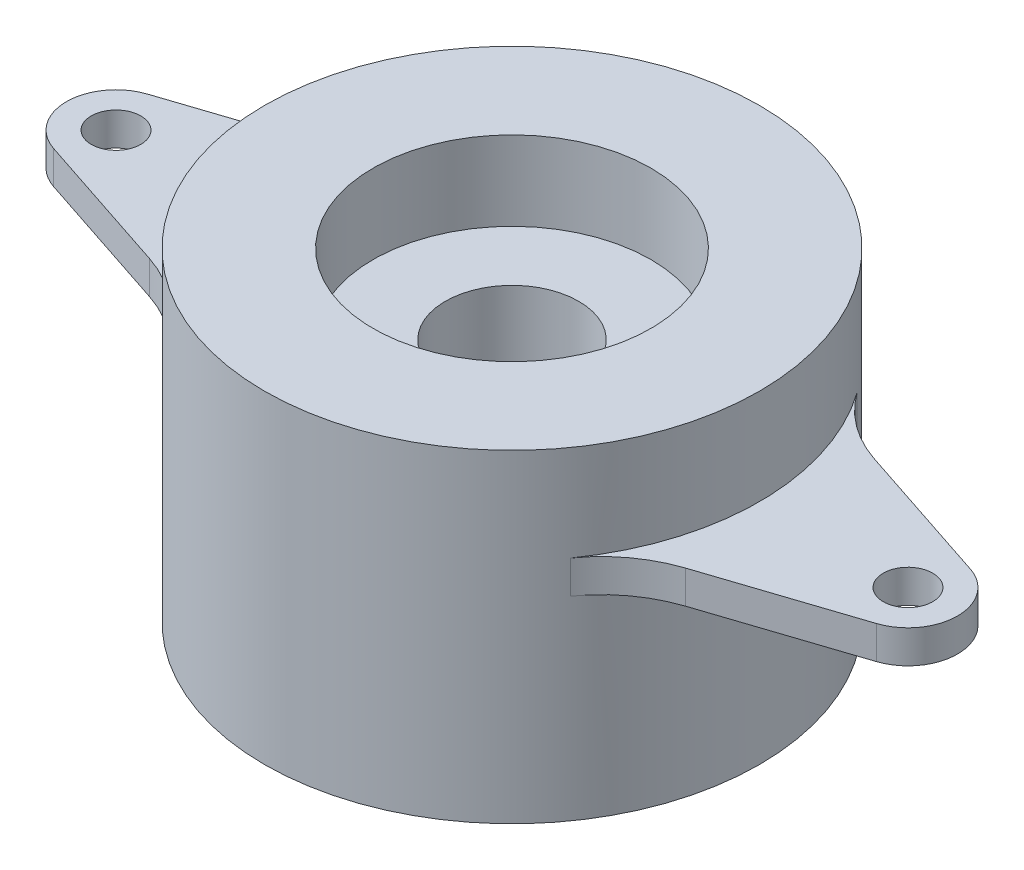
ISO-10303-21;
HEADER;
FILE_DESCRIPTION(('STEP AP214'),'2;1');
FILE_NAME('part.step','',(''),(''),'','','');
FILE_SCHEMA(('AUTOMOTIVE_DESIGN { 1 0 10303 214 1 1 1 1 }'));
ENDSEC;
DATA;
#1=APPLICATION_CONTEXT('core data for automotive mechanical design processes');
#2=APPLICATION_PROTOCOL_DEFINITION('international standard','automotive_design',2000,#1);
#3=PRODUCT_CONTEXT('',#1,'mechanical');
#4=PRODUCT('Part','Part','',(#3));
#5=PRODUCT_RELATED_PRODUCT_CATEGORY('part','',(#4));
#6=PRODUCT_DEFINITION_FORMATION('','',#4);
#7=PRODUCT_DEFINITION_CONTEXT('part definition',#1,'design');
#8=PRODUCT_DEFINITION('design','',#6,#7);
#9=PRODUCT_DEFINITION_SHAPE('','',#8);
#10=(LENGTH_UNIT() NAMED_UNIT(*) SI_UNIT(.MILLI.,.METRE.));
#11=(NAMED_UNIT(*) PLANE_ANGLE_UNIT() SI_UNIT($,.RADIAN.));
#12=(NAMED_UNIT(*) SI_UNIT($,.STERADIAN.) SOLID_ANGLE_UNIT());
#13=UNCERTAINTY_MEASURE_WITH_UNIT(LENGTH_MEASURE(1.E-05),#10,'distance_accuracy_value','');
#14=(GEOMETRIC_REPRESENTATION_CONTEXT(3) GLOBAL_UNCERTAINTY_ASSIGNED_CONTEXT((#13)) GLOBAL_UNIT_ASSIGNED_CONTEXT((#10,
#11,#12)) REPRESENTATION_CONTEXT('',''));
#15=CARTESIAN_POINT('',(0.,0.,0.));
#16=DIRECTION('',(0.,0.,1.));
#17=DIRECTION('',(1.,0.,0.));
#18=AXIS2_PLACEMENT_3D('',#15,#16,#17);
#19=CARTESIAN_POINT('',(0.,0.,0.));
#20=DIRECTION('',(0.,-1.,0.));
#21=DIRECTION('',(0.,0.,-1.));
#22=AXIS2_PLACEMENT_3D('',#19,#20,#21);
#23=CYLINDRICAL_SURFACE('',#22,37.5);
#24=CARTESIAN_POINT('',(0.,24.5,0.));
#25=DIRECTION('',(0.,-1.,0.));
#26=DIRECTION('',(0.,0.,-1.));
#27=AXIS2_PLACEMENT_3D('',#24,#25,#26);
#28=CIRCLE('',#27,37.5);
#29=CARTESIAN_POINT('',(0.,24.5,-37.5));
#30=VERTEX_POINT('',#29);
#31=EDGE_CURVE('E234',#30,#30,#28,.T.);
#32=ORIENTED_EDGE('',*,*,#31,.T.);
#33=EDGE_LOOP('',(#32));
#34=FACE_BOUND('',#33,.T.);
#35=CARTESIAN_POINT('',(0.,-24.5,0.));
#36=DIRECTION('',(0.,-1.,0.));
#37=DIRECTION('',(0.,0.,-1.));
#38=AXIS2_PLACEMENT_3D('',#35,#36,#37);
#39=CIRCLE('',#38,37.5);
#40=CARTESIAN_POINT('',(0.,-24.5,-37.5));
#41=VERTEX_POINT('',#40);
#42=EDGE_CURVE('E231',#41,#41,#39,.T.);
#43=ORIENTED_EDGE('',*,*,#42,.F.);
#44=EDGE_LOOP('',(#43));
#45=FACE_BOUND('',#44,.T.);
#46=CARTESIAN_POINT('',(0.,10.,0.));
#47=DIRECTION('',(0.,1.,0.));
#48=DIRECTION('',(0.,0.,1.));
#49=AXIS2_PLACEMENT_3D('',#46,#47,#48);
#50=CIRCLE('',#49,37.5);
#51=CARTESIAN_POINT('',(-30.5697046910116,10.,21.7196490557362));
#52=VERTEX_POINT('',#51);
#53=CARTESIAN_POINT('',(-30.5697046910116,10.,-21.7196490557362));
#54=VERTEX_POINT('',#53);
#55=EDGE_CURVE('E242',#52,#54,#50,.F.);
#56=ORIENTED_EDGE('',*,*,#55,.F.);
#57=DIRECTION('',(0.,-1.,0.));
#58=VECTOR('',#57,1.);
#59=CARTESIAN_POINT('',(-30.5697046910116,10.,21.7196490557362));
#60=LINE('',#59,#58);
#61=CARTESIAN_POINT('',(-30.5697046910116,5.,21.7196490557362));
#62=VERTEX_POINT('',#61);
#63=EDGE_CURVE('E208',#52,#62,#60,.T.);
#64=ORIENTED_EDGE('',*,*,#63,.T.);
#65=CARTESIAN_POINT('',(0.,5.,0.));
#66=DIRECTION('',(0.,1.,0.));
#67=DIRECTION('',(0.,0.,1.));
#68=AXIS2_PLACEMENT_3D('',#65,#66,#67);
#69=CIRCLE('',#68,37.5);
#70=CARTESIAN_POINT('',(-30.5697046910116,5.,-21.7196490557362));
#71=VERTEX_POINT('',#70);
#72=EDGE_CURVE('E240',#62,#71,#69,.F.);
#73=ORIENTED_EDGE('',*,*,#72,.T.);
#74=DIRECTION('',(0.,-1.,0.));
#75=VECTOR('',#74,1.);
#76=CARTESIAN_POINT('',(-30.5697046910116,10.,-21.7196490557362));
#77=LINE('',#76,#75);
#78=EDGE_CURVE('E205',#54,#71,#77,.T.);
#79=ORIENTED_EDGE('',*,*,#78,.F.);
#80=EDGE_LOOP('',(#56,#64,#73,#79));
#81=FACE_BOUND('',#80,.T.);
#82=CARTESIAN_POINT('',(0.,10.,0.));
#83=DIRECTION('',(0.,-1.,0.));
#84=DIRECTION('',(0.,0.,-1.));
#85=AXIS2_PLACEMENT_3D('',#82,#83,#84);
#86=CIRCLE('',#85,37.5);
#87=CARTESIAN_POINT('',(30.5697046910116,10.,21.7196490557362));
#88=VERTEX_POINT('',#87);
#89=CARTESIAN_POINT('',(30.5697046910116,10.,-21.7196490557362));
#90=VERTEX_POINT('',#89);
#91=EDGE_CURVE('E11',#88,#90,#86,.F.);
#92=ORIENTED_EDGE('',*,*,#91,.T.);
#93=DIRECTION('',(0.,-1.,0.));
#94=VECTOR('',#93,1.);
#95=CARTESIAN_POINT('',(30.5697046910116,10.,-21.7196490557362));
#96=LINE('',#95,#94);
#97=CARTESIAN_POINT('',(30.5697046910116,5.,-21.7196490557362));
#98=VERTEX_POINT('',#97);
#99=EDGE_CURVE('E51',#90,#98,#96,.T.);
#100=ORIENTED_EDGE('',*,*,#99,.T.);
#101=CARTESIAN_POINT('',(0.,5.,0.));
#102=DIRECTION('',(0.,-1.,0.));
#103=DIRECTION('',(0.,0.,-1.));
#104=AXIS2_PLACEMENT_3D('',#101,#102,#103);
#105=CIRCLE('',#104,37.5);
#106=CARTESIAN_POINT('',(30.5697046910116,5.,21.7196490557362));
#107=VERTEX_POINT('',#106);
#108=EDGE_CURVE('E41',#107,#98,#105,.F.);
#109=ORIENTED_EDGE('',*,*,#108,.F.);
#110=DIRECTION('',(0.,-1.,0.));
#111=VECTOR('',#110,1.);
#112=CARTESIAN_POINT('',(30.5697046910116,10.,21.7196490557362));
#113=LINE('',#112,#111);
#114=EDGE_CURVE('E136',#88,#107,#113,.T.);
#115=ORIENTED_EDGE('',*,*,#114,.F.);
#116=EDGE_LOOP('',(#92,#100,#109,#115));
#117=FACE_BOUND('',#116,.T.);
#118=ADVANCED_FACE('F33',(#34,#45,#81,#117),#23,.T.);
#119=CARTESIAN_POINT('',(0.,0.,0.));
#120=DIRECTION('',(0.,-1.,0.));
#121=DIRECTION('',(0.,0.,-1.));
#122=AXIS2_PLACEMENT_3D('',#119,#120,#121);
#123=CYLINDRICAL_SURFACE('',#122,21.05);
#124=CARTESIAN_POINT('',(0.,12.5,0.));
#125=DIRECTION('',(0.,-1.,0.));
#126=DIRECTION('',(0.,0.,-1.));
#127=AXIS2_PLACEMENT_3D('',#124,#125,#126);
#128=CIRCLE('',#127,21.05);
#129=CARTESIAN_POINT('',(0.,12.5,-21.05));
#130=VERTEX_POINT('',#129);
#131=EDGE_CURVE('E216',#130,#130,#128,.T.);
#132=ORIENTED_EDGE('',*,*,#131,.T.);
#133=EDGE_LOOP('',(#132));
#134=FACE_BOUND('',#133,.T.);
#135=CARTESIAN_POINT('',(0.,24.5,0.));
#136=DIRECTION('',(0.,-1.,0.));
#137=DIRECTION('',(0.,0.,-1.));
#138=AXIS2_PLACEMENT_3D('',#135,#136,#137);
#139=CIRCLE('',#138,21.05);
#140=CARTESIAN_POINT('',(0.,24.5,-21.05));
#141=VERTEX_POINT('',#140);
#142=EDGE_CURVE('E237',#141,#141,#139,.T.);
#143=ORIENTED_EDGE('',*,*,#142,.F.);
#144=EDGE_LOOP('',(#143));
#145=FACE_BOUND('',#144,.T.);
#146=ADVANCED_FACE('F35',(#134,#145),#123,.F.);
#147=CARTESIAN_POINT('',(21.05,24.5,0.));
#148=DIRECTION('',(0.,1.,0.));
#149=DIRECTION('',(0.,0.,1.));
#150=AXIS2_PLACEMENT_3D('',#147,#148,#149);
#151=PLANE('',#150);
#152=ORIENTED_EDGE('',*,*,#142,.T.);
#153=EDGE_LOOP('',(#152));
#154=FACE_BOUND('',#153,.T.);
#155=ORIENTED_EDGE('',*,*,#31,.F.);
#156=EDGE_LOOP('',(#155));
#157=FACE_BOUND('',#156,.T.);
#158=ADVANCED_FACE('F287',(#154,#157),#151,.T.);
#159=CARTESIAN_POINT('',(37.5,-24.5,0.));
#160=DIRECTION('',(0.,-1.,0.));
#161=DIRECTION('',(0.,0.,-1.));
#162=AXIS2_PLACEMENT_3D('',#159,#160,#161);
#163=PLANE('',#162);
#164=ORIENTED_EDGE('',*,*,#42,.T.);
#165=EDGE_LOOP('',(#164));
#166=FACE_BOUND('',#165,.T.);
#167=CARTESIAN_POINT('',(0.,-24.5,0.));
#168=DIRECTION('',(0.,-1.,0.));
#169=DIRECTION('',(0.,0.,-1.));
#170=AXIS2_PLACEMENT_3D('',#167,#168,#169);
#171=CIRCLE('',#170,21.05);
#172=CARTESIAN_POINT('',(0.,-24.5,-21.05));
#173=VERTEX_POINT('',#172);
#174=EDGE_CURVE('E228',#173,#173,#171,.T.);
#175=ORIENTED_EDGE('',*,*,#174,.F.);
#176=EDGE_LOOP('',(#175));
#177=FACE_BOUND('',#176,.T.);
#178=ADVANCED_FACE('F291',(#166,#177),#163,.T.);
#179=CARTESIAN_POINT('',(0.,0.,0.));
#180=DIRECTION('',(0.,-1.,0.));
#181=DIRECTION('',(0.,0.,-1.));
#182=AXIS2_PLACEMENT_3D('',#179,#180,#181);
#183=CYLINDRICAL_SURFACE('',#182,21.05);
#184=ORIENTED_EDGE('',*,*,#174,.T.);
#185=EDGE_LOOP('',(#184));
#186=FACE_BOUND('',#185,.T.);
#187=CARTESIAN_POINT('',(0.,-12.5,0.));
#188=DIRECTION('',(0.,-1.,0.));
#189=DIRECTION('',(0.,0.,-1.));
#190=AXIS2_PLACEMENT_3D('',#187,#188,#189);
#191=CIRCLE('',#190,21.05);
#192=CARTESIAN_POINT('',(0.,-12.5,-21.05));
#193=VERTEX_POINT('',#192);
#194=EDGE_CURVE('E225',#193,#193,#191,.T.);
#195=ORIENTED_EDGE('',*,*,#194,.F.);
#196=EDGE_LOOP('',(#195));
#197=FACE_BOUND('',#196,.T.);
#198=ADVANCED_FACE('F298',(#186,#197),#183,.F.);
#199=CARTESIAN_POINT('',(21.05,-12.5,0.));
#200=DIRECTION('',(0.,-1.,0.));
#201=DIRECTION('',(0.,0.,-1.));
#202=AXIS2_PLACEMENT_3D('',#199,#200,#201);
#203=PLANE('',#202);
#204=ORIENTED_EDGE('',*,*,#194,.T.);
#205=EDGE_LOOP('',(#204));
#206=FACE_BOUND('',#205,.T.);
#207=CARTESIAN_POINT('',(0.,-12.5,0.));
#208=DIRECTION('',(0.,-1.,0.));
#209=DIRECTION('',(0.,0.,-1.));
#210=AXIS2_PLACEMENT_3D('',#207,#208,#209);
#211=CIRCLE('',#210,10.1);
#212=CARTESIAN_POINT('',(0.,-12.5,-10.1));
#213=VERTEX_POINT('',#212);
#214=EDGE_CURVE('E222',#213,#213,#211,.T.);
#215=ORIENTED_EDGE('',*,*,#214,.F.);
#216=EDGE_LOOP('',(#215));
#217=FACE_BOUND('',#216,.T.);
#218=ADVANCED_FACE('F307',(#206,#217),#203,.T.);
#219=CARTESIAN_POINT('',(0.,0.,0.));
#220=DIRECTION('',(0.,-1.,0.));
#221=DIRECTION('',(0.,0.,-1.));
#222=AXIS2_PLACEMENT_3D('',#219,#220,#221);
#223=CYLINDRICAL_SURFACE('',#222,10.1);
#224=ORIENTED_EDGE('',*,*,#214,.T.);
#225=EDGE_LOOP('',(#224));
#226=FACE_BOUND('',#225,.T.);
#227=CARTESIAN_POINT('',(0.,12.5,0.));
#228=DIRECTION('',(0.,-1.,0.));
#229=DIRECTION('',(0.,0.,-1.));
#230=AXIS2_PLACEMENT_3D('',#227,#228,#229);
#231=CIRCLE('',#230,10.1);
#232=CARTESIAN_POINT('',(0.,12.5,-10.1));
#233=VERTEX_POINT('',#232);
#234=EDGE_CURVE('E219',#233,#233,#231,.T.);
#235=ORIENTED_EDGE('',*,*,#234,.F.);
#236=EDGE_LOOP('',(#235));
#237=FACE_BOUND('',#236,.T.);
#238=ADVANCED_FACE('F317',(#226,#237),#223,.F.);
#239=CARTESIAN_POINT('',(21.05,12.5,0.));
#240=DIRECTION('',(0.,1.,0.));
#241=DIRECTION('',(0.,0.,1.));
#242=AXIS2_PLACEMENT_3D('',#239,#240,#241);
#243=PLANE('',#242);
#244=ORIENTED_EDGE('',*,*,#234,.T.);
#245=EDGE_LOOP('',(#244));
#246=FACE_BOUND('',#245,.T.);
#247=ORIENTED_EDGE('',*,*,#131,.F.);
#248=EDGE_LOOP('',(#247));
#249=FACE_BOUND('',#248,.T.);
#250=ADVANCED_FACE('F323',(#246,#249),#243,.T.);
#251=CARTESIAN_POINT('',(-60.,10.,0.));
#252=DIRECTION('',(0.,1.,0.));
#253=DIRECTION('',(0.,0.,1.));
#254=AXIS2_PLACEMENT_3D('',#251,#252,#253);
#255=PLANE('',#254);
#256=CARTESIAN_POINT('',(-46.8735471928845,10.,33.3034618854621));
#257=DIRECTION('',(0.,-1.,0.));
#258=DIRECTION('',(0.,0.,-1.));
#259=AXIS2_PLACEMENT_3D('',#256,#257,#258);
#260=CIRCLE('',#259,20.);
#261=CARTESIAN_POINT('',(-40.5957296354816,10.,14.3142805783082));
#262=VERTEX_POINT('',#261);
#263=EDGE_CURVE('E182',#262,#52,#260,.T.);
#264=ORIENTED_EDGE('',*,*,#263,.T.);
#265=ORIENTED_EDGE('',*,*,#55,.T.);
#266=CARTESIAN_POINT('',(-46.8735471928845,10.,-33.3034618854621));
#267=DIRECTION('',(0.,-1.,0.));
#268=DIRECTION('',(0.,0.,1.));
#269=AXIS2_PLACEMENT_3D('',#266,#267,#268);
#270=CIRCLE('',#269,20.);
#271=CARTESIAN_POINT('',(-40.5957296354816,10.,-14.3142805783082));
#272=VERTEX_POINT('',#271);
#273=EDGE_CURVE('E185',#54,#272,#270,.T.);
#274=ORIENTED_EDGE('',*,*,#273,.T.);
#275=DIRECTION('',(-0.949459065357696,0.,0.313890877870145));
#276=VECTOR('',#275,1.);
#277=CARTESIAN_POINT('',(-62.3541815840261,10.,-7.12094299018272));
#278=LINE('',#277,#276);
#279=CARTESIAN_POINT('',(-62.3541815840261,10.,-7.12094299018272));
#280=VERTEX_POINT('',#279);
#281=EDGE_CURVE('E187',#272,#280,#278,.T.);
#282=ORIENTED_EDGE('',*,*,#281,.T.);
#283=CARTESIAN_POINT('',(-60.,10.,0.));
#284=DIRECTION('',(0.,1.,0.));
#285=DIRECTION('',(0.,0.,1.));
#286=AXIS2_PLACEMENT_3D('',#283,#284,#285);
#287=CIRCLE('',#286,7.5);
#288=CARTESIAN_POINT('',(-62.3541815840261,10.,7.12094299018272));
#289=VERTEX_POINT('',#288);
#290=EDGE_CURVE('E176',#280,#289,#287,.T.);
#291=ORIENTED_EDGE('',*,*,#290,.T.);
#292=DIRECTION('',(0.949459065357696,0.,0.313890877870145));
#293=VECTOR('',#292,1.);
#294=CARTESIAN_POINT('',(-62.3541815840261,10.,7.12094299018272));
#295=LINE('',#294,#293);
#296=EDGE_CURVE('E179',#289,#262,#295,.T.);
#297=ORIENTED_EDGE('',*,*,#296,.T.);
#298=EDGE_LOOP('',(#264,#265,#274,#282,#291,#297));
#299=FACE_BOUND('',#298,.T.);
#300=CARTESIAN_POINT('',(-60.,10.,0.));
#301=DIRECTION('',(0.,1.,0.));
#302=DIRECTION('',(0.,0.,1.));
#303=AXIS2_PLACEMENT_3D('',#300,#301,#302);
#304=CIRCLE('',#303,3.75000000000001);
#305=CARTESIAN_POINT('',(-60.,10.,3.75000000000001));
#306=VERTEX_POINT('',#305);
#307=EDGE_CURVE('E170',#306,#306,#304,.T.);
#308=ORIENTED_EDGE('',*,*,#307,.F.);
#309=EDGE_LOOP('',(#308));
#310=FACE_BOUND('',#309,.T.);
#311=ADVANCED_FACE('F329',(#299,#310),#255,.T.);
#312=CARTESIAN_POINT('',(-60.,5.,0.));
#313=DIRECTION('',(0.,1.,0.));
#314=DIRECTION('',(0.,0.,1.));
#315=AXIS2_PLACEMENT_3D('',#312,#313,#314);
#316=PLANE('',#315);
#317=ORIENTED_EDGE('',*,*,#72,.F.);
#318=CARTESIAN_POINT('',(-46.8735471928845,5.,33.3034618854621));
#319=DIRECTION('',(0.,-1.,0.));
#320=DIRECTION('',(0.,0.,-1.));
#321=AXIS2_PLACEMENT_3D('',#318,#319,#320);
#322=CIRCLE('',#321,20.);
#323=CARTESIAN_POINT('',(-40.5957296354816,5.,14.3142805783082));
#324=VERTEX_POINT('',#323);
#325=EDGE_CURVE('E194',#324,#62,#322,.T.);
#326=ORIENTED_EDGE('',*,*,#325,.F.);
#327=DIRECTION('',(0.949459065357696,0.,0.313890877870145));
#328=VECTOR('',#327,1.);
#329=CARTESIAN_POINT('',(-62.3541815840261,5.,7.12094299018272));
#330=LINE('',#329,#328);
#331=CARTESIAN_POINT('',(-62.3541815840261,5.,7.12094299018272));
#332=VERTEX_POINT('',#331);
#333=EDGE_CURVE('E192',#332,#324,#330,.T.);
#334=ORIENTED_EDGE('',*,*,#333,.F.);
#335=CARTESIAN_POINT('',(-60.,5.,0.));
#336=DIRECTION('',(0.,1.,0.));
#337=DIRECTION('',(0.,0.,1.));
#338=AXIS2_PLACEMENT_3D('',#335,#336,#337);
#339=CIRCLE('',#338,7.5);
#340=CARTESIAN_POINT('',(-62.3541815840261,5.,-7.12094299018272));
#341=VERTEX_POINT('',#340);
#342=EDGE_CURVE('E173',#341,#332,#339,.T.);
#343=ORIENTED_EDGE('',*,*,#342,.F.);
#344=DIRECTION('',(-0.949459065357696,0.,0.313890877870145));
#345=VECTOR('',#344,1.);
#346=CARTESIAN_POINT('',(-62.3541815840261,5.,-7.12094299018272));
#347=LINE('',#346,#345);
#348=CARTESIAN_POINT('',(-40.5957296354816,5.,-14.3142805783082));
#349=VERTEX_POINT('',#348);
#350=EDGE_CURVE('E180',#349,#341,#347,.T.);
#351=ORIENTED_EDGE('',*,*,#350,.F.);
#352=CARTESIAN_POINT('',(-46.8735471928845,5.,-33.3034618854621));
#353=DIRECTION('',(0.,-1.,0.));
#354=DIRECTION('',(0.,0.,1.));
#355=AXIS2_PLACEMENT_3D('',#352,#353,#354);
#356=CIRCLE('',#355,20.);
#357=EDGE_CURVE('E197',#71,#349,#356,.T.);
#358=ORIENTED_EDGE('',*,*,#357,.F.);
#359=EDGE_LOOP('',(#317,#326,#334,#343,#351,#358));
#360=FACE_BOUND('',#359,.T.);
#361=CARTESIAN_POINT('',(-60.,5.,0.));
#362=DIRECTION('',(0.,1.,0.));
#363=DIRECTION('',(0.,0.,1.));
#364=AXIS2_PLACEMENT_3D('',#361,#362,#363);
#365=CIRCLE('',#364,3.75000000000001);
#366=CARTESIAN_POINT('',(-60.,5.,3.75000000000001));
#367=VERTEX_POINT('',#366);
#368=EDGE_CURVE('E169',#367,#367,#365,.T.);
#369=ORIENTED_EDGE('',*,*,#368,.T.);
#370=EDGE_LOOP('',(#369));
#371=FACE_BOUND('',#370,.T.);
#372=ADVANCED_FACE('F335',(#360,#371),#316,.F.);
#373=CARTESIAN_POINT('',(-60.,10.,0.));
#374=DIRECTION('',(0.,-1.,0.));
#375=DIRECTION('',(0.,0.,-1.));
#376=AXIS2_PLACEMENT_3D('',#373,#374,#375);
#377=CYLINDRICAL_SURFACE('',#376,7.5);
#378=ORIENTED_EDGE('',*,*,#342,.T.);
#379=DIRECTION('',(0.,-1.,0.));
#380=VECTOR('',#379,1.);
#381=CARTESIAN_POINT('',(-62.3541815840261,10.,7.12094299018272));
#382=LINE('',#381,#380);
#383=EDGE_CURVE('E213',#289,#332,#382,.T.);
#384=ORIENTED_EDGE('',*,*,#383,.F.);
#385=ORIENTED_EDGE('',*,*,#290,.F.);
#386=DIRECTION('',(0.,-1.,0.));
#387=VECTOR('',#386,1.);
#388=CARTESIAN_POINT('',(-62.3541815840261,10.,-7.12094299018272));
#389=LINE('',#388,#387);
#390=EDGE_CURVE('E189',#280,#341,#389,.T.);
#391=ORIENTED_EDGE('',*,*,#390,.T.);
#392=EDGE_LOOP('',(#378,#384,#385,#391));
#393=FACE_BOUND('',#392,.T.);
#394=ADVANCED_FACE('F339',(#393),#377,.T.);
#395=CARTESIAN_POINT('',(-62.3541815840261,10.,7.12094299018272));
#396=DIRECTION('',(0.313890877870145,0.,-0.949459065357696));
#397=DIRECTION('',(-0.949459065357696,0.,-0.313890877870145));
#398=AXIS2_PLACEMENT_3D('',#395,#396,#397);
#399=PLANE('',#398);
#400=ORIENTED_EDGE('',*,*,#333,.T.);
#401=DIRECTION('',(0.,-1.,0.));
#402=VECTOR('',#401,1.);
#403=CARTESIAN_POINT('',(-40.5957296354816,10.,14.3142805783082));
#404=LINE('',#403,#402);
#405=EDGE_CURVE('E210',#262,#324,#404,.T.);
#406=ORIENTED_EDGE('',*,*,#405,.F.);
#407=ORIENTED_EDGE('',*,*,#296,.F.);
#408=ORIENTED_EDGE('',*,*,#383,.T.);
#409=EDGE_LOOP('',(#400,#406,#407,#408));
#410=FACE_BOUND('',#409,.T.);
#411=ADVANCED_FACE('F342',(#410),#399,.F.);
#412=CARTESIAN_POINT('',(-46.8735471928845,10.,33.3034618854621));
#413=DIRECTION('',(0.,-1.,0.));
#414=DIRECTION('',(0.,0.,-1.));
#415=AXIS2_PLACEMENT_3D('',#412,#413,#414);
#416=CYLINDRICAL_SURFACE('',#415,20.);
#417=ORIENTED_EDGE('',*,*,#325,.T.);
#418=ORIENTED_EDGE('',*,*,#63,.F.);
#419=ORIENTED_EDGE('',*,*,#263,.F.);
#420=ORIENTED_EDGE('',*,*,#405,.T.);
#421=EDGE_LOOP('',(#417,#418,#419,#420));
#422=FACE_BOUND('',#421,.T.);
#423=ADVANCED_FACE('F346',(#422),#416,.F.);
#424=CARTESIAN_POINT('',(-46.8735471928845,10.,-33.3034618854621));
#425=DIRECTION('',(0.,-1.,0.));
#426=DIRECTION('',(0.,0.,-1.));
#427=AXIS2_PLACEMENT_3D('',#424,#425,#426);
#428=CYLINDRICAL_SURFACE('',#427,20.);
#429=ORIENTED_EDGE('',*,*,#357,.T.);
#430=DIRECTION('',(0.,-1.,0.));
#431=VECTOR('',#430,1.);
#432=CARTESIAN_POINT('',(-40.5957296354816,10.,-14.3142805783082));
#433=LINE('',#432,#431);
#434=EDGE_CURVE('E202',#272,#349,#433,.T.);
#435=ORIENTED_EDGE('',*,*,#434,.F.);
#436=ORIENTED_EDGE('',*,*,#273,.F.);
#437=ORIENTED_EDGE('',*,*,#78,.T.);
#438=EDGE_LOOP('',(#429,#435,#436,#437));
#439=FACE_BOUND('',#438,.T.);
#440=ADVANCED_FACE('F350',(#439),#428,.F.);
#441=CARTESIAN_POINT('',(-62.3541815840261,10.,-7.12094299018272));
#442=DIRECTION('',(0.313890877870145,0.,0.949459065357696));
#443=DIRECTION('',(0.949459065357696,0.,-0.313890877870145));
#444=AXIS2_PLACEMENT_3D('',#441,#442,#443);
#445=PLANE('',#444);
#446=ORIENTED_EDGE('',*,*,#350,.T.);
#447=ORIENTED_EDGE('',*,*,#390,.F.);
#448=ORIENTED_EDGE('',*,*,#281,.F.);
#449=ORIENTED_EDGE('',*,*,#434,.T.);
#450=EDGE_LOOP('',(#446,#447,#448,#449));
#451=FACE_BOUND('',#450,.T.);
#452=ADVANCED_FACE('F277',(#451),#445,.F.);
#453=CARTESIAN_POINT('',(-60.,10.,0.));
#454=DIRECTION('',(0.,-1.,0.));
#455=DIRECTION('',(0.,0.,-1.));
#456=AXIS2_PLACEMENT_3D('',#453,#454,#455);
#457=CYLINDRICAL_SURFACE('',#456,3.75000000000001);
#458=ORIENTED_EDGE('',*,*,#307,.T.);
#459=EDGE_LOOP('',(#458));
#460=FACE_BOUND('',#459,.T.);
#461=ORIENTED_EDGE('',*,*,#368,.F.);
#462=EDGE_LOOP('',(#461));
#463=FACE_BOUND('',#462,.T.);
#464=ADVANCED_FACE('F270',(#460,#463),#457,.F.);
#465=CARTESIAN_POINT('',(46.8735471928845,10.,-33.3034618854621));
#466=DIRECTION('',(0.,-1.,0.));
#467=DIRECTION('',(0.,0.,-1.));
#468=AXIS2_PLACEMENT_3D('',#465,#466,#467);
#469=PLANE('',#468);
#470=ORIENTED_EDGE('',*,*,#91,.F.);
#471=CARTESIAN_POINT('',(46.8735471928845,10.,33.3034618854621));
#472=DIRECTION('',(0.,-1.,0.));
#473=DIRECTION('',(0.,0.,1.));
#474=AXIS2_PLACEMENT_3D('',#471,#472,#473);
#475=CIRCLE('',#474,20.);
#476=CARTESIAN_POINT('',(40.5957296354816,10.,14.3142805783082));
#477=VERTEX_POINT('',#476);
#478=EDGE_CURVE('E118',#88,#477,#475,.T.);
#479=ORIENTED_EDGE('',*,*,#478,.T.);
#480=DIRECTION('',(0.949459065357696,0.,-0.313890877870145));
#481=VECTOR('',#480,1.);
#482=CARTESIAN_POINT('',(62.3541815840261,10.,7.12094299018272));
#483=LINE('',#482,#481);
#484=CARTESIAN_POINT('',(62.3541815840261,10.,7.1209429901827));
#485=VERTEX_POINT('',#484);
#486=EDGE_CURVE('E123',#477,#485,#483,.T.);
#487=ORIENTED_EDGE('',*,*,#486,.T.);
#488=CARTESIAN_POINT('',(60.,10.,0.));
#489=DIRECTION('',(0.,1.,0.));
#490=DIRECTION('',(0.,0.,-1.));
#491=AXIS2_PLACEMENT_3D('',#488,#489,#490);
#492=CIRCLE('',#491,7.5);
#493=CARTESIAN_POINT('',(62.3541815840261,10.,-7.12094299018272));
#494=VERTEX_POINT('',#493);
#495=EDGE_CURVE('E142',#485,#494,#492,.T.);
#496=ORIENTED_EDGE('',*,*,#495,.T.);
#497=DIRECTION('',(-0.949459065357696,0.,-0.313890877870145));
#498=VECTOR('',#497,1.);
#499=CARTESIAN_POINT('',(62.3541815840261,10.,-7.12094299018272));
#500=LINE('',#499,#498);
#501=CARTESIAN_POINT('',(40.5957296354816,10.,-14.3142805783082));
#502=VERTEX_POINT('',#501);
#503=EDGE_CURVE('E144',#494,#502,#500,.T.);
#504=ORIENTED_EDGE('',*,*,#503,.T.);
#505=CARTESIAN_POINT('',(46.8735471928845,10.,-33.3034618854621));
#506=DIRECTION('',(0.,-1.,0.));
#507=DIRECTION('',(0.,0.,-1.));
#508=AXIS2_PLACEMENT_3D('',#505,#506,#507);
#509=CIRCLE('',#508,20.);
#510=EDGE_CURVE('E127',#502,#90,#509,.T.);
#511=ORIENTED_EDGE('',*,*,#510,.T.);
#512=EDGE_LOOP('',(#470,#479,#487,#496,#504,#511));
#513=FACE_BOUND('',#512,.T.);
#514=CARTESIAN_POINT('',(60.,10.,0.));
#515=DIRECTION('',(0.,1.,0.));
#516=DIRECTION('',(0.,0.,-1.));
#517=AXIS2_PLACEMENT_3D('',#514,#515,#516);
#518=CIRCLE('',#517,3.75000000000011);
#519=CARTESIAN_POINT('',(60.,10.,-3.75000000000014));
#520=VERTEX_POINT('',#519);
#521=EDGE_CURVE('E153',#520,#520,#518,.T.);
#522=ORIENTED_EDGE('',*,*,#521,.F.);
#523=EDGE_LOOP('',(#522));
#524=FACE_BOUND('',#523,.T.);
#525=ADVANCED_FACE('F120',(#513,#524),#469,.F.);
#526=CARTESIAN_POINT('',(46.8735471928845,5.,-33.3034618854621));
#527=DIRECTION('',(0.,-1.,0.));
#528=DIRECTION('',(0.,0.,-1.));
#529=AXIS2_PLACEMENT_3D('',#526,#527,#528);
#530=PLANE('',#529);
#531=CARTESIAN_POINT('',(46.8735471928845,5.,33.3034618854621));
#532=DIRECTION('',(0.,-1.,0.));
#533=DIRECTION('',(0.,0.,1.));
#534=AXIS2_PLACEMENT_3D('',#531,#532,#533);
#535=CIRCLE('',#534,20.);
#536=CARTESIAN_POINT('',(40.5957296354816,5.,14.3142805783082));
#537=VERTEX_POINT('',#536);
#538=EDGE_CURVE('E133',#107,#537,#535,.T.);
#539=ORIENTED_EDGE('',*,*,#538,.F.);
#540=ORIENTED_EDGE('',*,*,#108,.T.);
#541=CARTESIAN_POINT('',(46.8735471928845,5.,-33.3034618854621));
#542=DIRECTION('',(0.,-1.,0.));
#543=DIRECTION('',(0.,0.,-1.));
#544=AXIS2_PLACEMENT_3D('',#541,#542,#543);
#545=CIRCLE('',#544,20.);
#546=CARTESIAN_POINT('',(40.5957296354816,5.,-14.3142805783082));
#547=VERTEX_POINT('',#546);
#548=EDGE_CURVE('E150',#547,#98,#545,.T.);
#549=ORIENTED_EDGE('',*,*,#548,.F.);
#550=DIRECTION('',(-0.949459065357696,0.,-0.313890877870145));
#551=VECTOR('',#550,1.);
#552=CARTESIAN_POINT('',(62.3541815840261,5.,-7.12094299018272));
#553=LINE('',#552,#551);
#554=CARTESIAN_POINT('',(62.3541815840261,5.,-7.12094299018272));
#555=VERTEX_POINT('',#554);
#556=EDGE_CURVE('E159',#555,#547,#553,.T.);
#557=ORIENTED_EDGE('',*,*,#556,.F.);
#558=CARTESIAN_POINT('',(60.,5.,0.));
#559=DIRECTION('',(0.,1.,0.));
#560=DIRECTION('',(0.,0.,-1.));
#561=AXIS2_PLACEMENT_3D('',#558,#559,#560);
#562=CIRCLE('',#561,7.5);
#563=CARTESIAN_POINT('',(62.3541815840261,5.,7.1209429901827));
#564=VERTEX_POINT('',#563);
#565=EDGE_CURVE('E157',#564,#555,#562,.T.);
#566=ORIENTED_EDGE('',*,*,#565,.F.);
#567=DIRECTION('',(0.949459065357696,0.,-0.313890877870145));
#568=VECTOR('',#567,1.);
#569=CARTESIAN_POINT('',(62.3541815840261,5.,7.12094299018272));
#570=LINE('',#569,#568);
#571=EDGE_CURVE('E155',#537,#564,#570,.T.);
#572=ORIENTED_EDGE('',*,*,#571,.F.);
#573=EDGE_LOOP('',(#539,#540,#549,#557,#566,#572));
#574=FACE_BOUND('',#573,.T.);
#575=CARTESIAN_POINT('',(60.,5.,0.));
#576=DIRECTION('',(0.,1.,0.));
#577=DIRECTION('',(0.,0.,-1.));
#578=AXIS2_PLACEMENT_3D('',#575,#576,#577);
#579=CIRCLE('',#578,3.75000000000011);
#580=CARTESIAN_POINT('',(60.,5.,-3.75000000000014));
#581=VERTEX_POINT('',#580);
#582=EDGE_CURVE('E261',#581,#581,#579,.T.);
#583=ORIENTED_EDGE('',*,*,#582,.T.);
#584=EDGE_LOOP('',(#583));
#585=FACE_BOUND('',#584,.T.);
#586=ADVANCED_FACE('F246',(#574,#585),#530,.T.);
#587=CARTESIAN_POINT('',(46.8735471928845,10.,-33.3034618854621));
#588=DIRECTION('',(0.,-1.,0.));
#589=DIRECTION('',(0.,0.,-1.));
#590=AXIS2_PLACEMENT_3D('',#587,#588,#589);
#591=CYLINDRICAL_SURFACE('',#590,20.);
#592=ORIENTED_EDGE('',*,*,#548,.T.);
#593=ORIENTED_EDGE('',*,*,#99,.F.);
#594=ORIENTED_EDGE('',*,*,#510,.F.);
#595=DIRECTION('',(0.,-1.,0.));
#596=VECTOR('',#595,1.);
#597=CARTESIAN_POINT('',(40.5957296354816,10.,-14.3142805783082));
#598=LINE('',#597,#596);
#599=EDGE_CURVE('E149',#502,#547,#598,.T.);
#600=ORIENTED_EDGE('',*,*,#599,.T.);
#601=EDGE_LOOP('',(#592,#593,#594,#600));
#602=FACE_BOUND('',#601,.T.);
#603=ADVANCED_FACE('F250',(#602),#591,.F.);
#604=CARTESIAN_POINT('',(46.8735471928845,10.,33.3034618854621));
#605=DIRECTION('',(0.,-1.,0.));
#606=DIRECTION('',(0.,0.,-1.));
#607=AXIS2_PLACEMENT_3D('',#604,#605,#606);
#608=CYLINDRICAL_SURFACE('',#607,20.);
#609=ORIENTED_EDGE('',*,*,#538,.T.);
#610=DIRECTION('',(0.,-1.,0.));
#611=VECTOR('',#610,1.);
#612=CARTESIAN_POINT('',(40.5957296354816,10.,14.3142805783082));
#613=LINE('',#612,#611);
#614=EDGE_CURVE('E130',#477,#537,#613,.T.);
#615=ORIENTED_EDGE('',*,*,#614,.F.);
#616=ORIENTED_EDGE('',*,*,#478,.F.);
#617=ORIENTED_EDGE('',*,*,#114,.T.);
#618=EDGE_LOOP('',(#609,#615,#616,#617));
#619=FACE_BOUND('',#618,.T.);
#620=ADVANCED_FACE('F131',(#619),#608,.F.);
#621=CARTESIAN_POINT('',(62.3541815840261,10.,7.12094299018272));
#622=DIRECTION('',(-0.313890877870145,0.,-0.949459065357696));
#623=DIRECTION('',(-0.949459065357696,0.,0.313890877870145));
#624=AXIS2_PLACEMENT_3D('',#621,#622,#623);
#625=PLANE('',#624);
#626=ORIENTED_EDGE('',*,*,#571,.T.);
#627=DIRECTION('',(0.,-1.,0.));
#628=VECTOR('',#627,1.);
#629=CARTESIAN_POINT('',(62.3541815840261,10.,7.1209429901827));
#630=LINE('',#629,#628);
#631=EDGE_CURVE('E137',#485,#564,#630,.T.);
#632=ORIENTED_EDGE('',*,*,#631,.F.);
#633=ORIENTED_EDGE('',*,*,#486,.F.);
#634=ORIENTED_EDGE('',*,*,#614,.T.);
#635=EDGE_LOOP('',(#626,#632,#633,#634));
#636=FACE_BOUND('',#635,.T.);
#637=ADVANCED_FACE('F139',(#636),#625,.F.);
#638=CARTESIAN_POINT('',(60.,10.,0.));
#639=DIRECTION('',(0.,-1.,0.));
#640=DIRECTION('',(0.,0.,-1.));
#641=AXIS2_PLACEMENT_3D('',#638,#639,#640);
#642=CYLINDRICAL_SURFACE('',#641,7.5);
#643=ORIENTED_EDGE('',*,*,#565,.T.);
#644=DIRECTION('',(0.,-1.,0.));
#645=VECTOR('',#644,1.);
#646=CARTESIAN_POINT('',(62.3541815840261,10.,-7.12094299018272));
#647=LINE('',#646,#645);
#648=EDGE_CURVE('E163',#494,#555,#647,.T.);
#649=ORIENTED_EDGE('',*,*,#648,.F.);
#650=ORIENTED_EDGE('',*,*,#495,.F.);
#651=ORIENTED_EDGE('',*,*,#631,.T.);
#652=EDGE_LOOP('',(#643,#649,#650,#651));
#653=FACE_BOUND('',#652,.T.);
#654=ADVANCED_FACE('F259',(#653),#642,.T.);
#655=CARTESIAN_POINT('',(62.3541815840261,10.,-7.12094299018272));
#656=DIRECTION('',(-0.313890877870145,0.,0.949459065357696));
#657=DIRECTION('',(0.949459065357696,0.,0.313890877870145));
#658=AXIS2_PLACEMENT_3D('',#655,#656,#657);
#659=PLANE('',#658);
#660=ORIENTED_EDGE('',*,*,#556,.T.);
#661=ORIENTED_EDGE('',*,*,#599,.F.);
#662=ORIENTED_EDGE('',*,*,#503,.F.);
#663=ORIENTED_EDGE('',*,*,#648,.T.);
#664=EDGE_LOOP('',(#660,#661,#662,#663));
#665=FACE_BOUND('',#664,.T.);
#666=ADVANCED_FACE('F255',(#665),#659,.F.);
#667=CARTESIAN_POINT('',(60.,10.,0.));
#668=DIRECTION('',(0.,-1.,0.));
#669=DIRECTION('',(0.,0.,-1.));
#670=AXIS2_PLACEMENT_3D('',#667,#668,#669);
#671=CYLINDRICAL_SURFACE('',#670,3.75000000000011);
#672=ORIENTED_EDGE('',*,*,#521,.T.);
#673=EDGE_LOOP('',(#672));
#674=FACE_BOUND('',#673,.T.);
#675=ORIENTED_EDGE('',*,*,#582,.F.);
#676=EDGE_LOOP('',(#675));
#677=FACE_BOUND('',#676,.T.);
#678=ADVANCED_FACE('F267',(#674,#677),#671,.F.);
#679=CLOSED_SHELL('',(#118,#146,#158,#178,#198,#218,#238,#250,#311,#372,#394,#411,#423,#440,
#452,#464,#525,#586,#603,#620,#637,#654,#666,#678));
#680=MANIFOLD_SOLID_BREP('B2',#679);
#681=ADVANCED_BREP_SHAPE_REPRESENTATION('',(#18,#680),#14);
#682=SHAPE_DEFINITION_REPRESENTATION(#9,#681);
ENDSEC;
END-ISO-10303-21;
